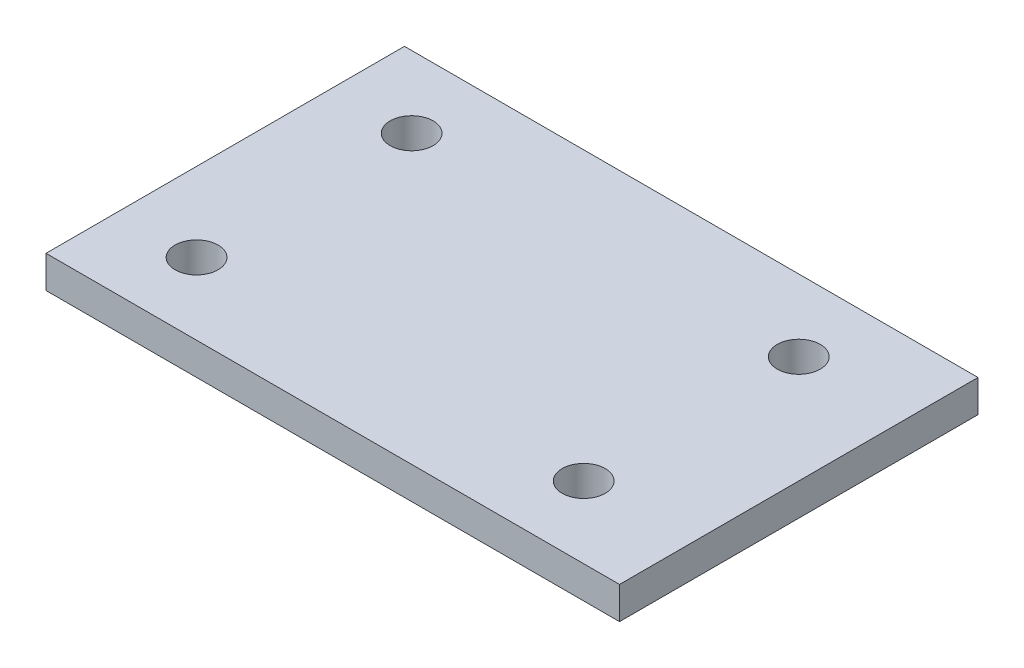
ISO-10303-21;
HEADER;
FILE_DESCRIPTION(('STEP AP214'),'2;1');
FILE_NAME('part.step','',(''),(''),'','','');
FILE_SCHEMA(('AUTOMOTIVE_DESIGN { 1 0 10303 214 1 1 1 1 }'));
ENDSEC;
DATA;
#1=APPLICATION_CONTEXT('core data for automotive mechanical design processes');
#2=APPLICATION_PROTOCOL_DEFINITION('international standard','automotive_design',2000,#1);
#3=PRODUCT_CONTEXT('',#1,'mechanical');
#4=PRODUCT('Part','Part','',(#3));
#5=PRODUCT_RELATED_PRODUCT_CATEGORY('part','',(#4));
#6=PRODUCT_DEFINITION_FORMATION('','',#4);
#7=PRODUCT_DEFINITION_CONTEXT('part definition',#1,'design');
#8=PRODUCT_DEFINITION('design','',#6,#7);
#9=PRODUCT_DEFINITION_SHAPE('','',#8);
#10=(LENGTH_UNIT() NAMED_UNIT(*) SI_UNIT(.MILLI.,.METRE.));
#11=(NAMED_UNIT(*) PLANE_ANGLE_UNIT() SI_UNIT($,.RADIAN.));
#12=(NAMED_UNIT(*) SI_UNIT($,.STERADIAN.) SOLID_ANGLE_UNIT());
#13=UNCERTAINTY_MEASURE_WITH_UNIT(LENGTH_MEASURE(1.E-05),#10,'distance_accuracy_value','');
#14=(GEOMETRIC_REPRESENTATION_CONTEXT(3) GLOBAL_UNCERTAINTY_ASSIGNED_CONTEXT((#13)) GLOBAL_UNIT_ASSIGNED_CONTEXT((#10,
#11,#12)) REPRESENTATION_CONTEXT('',''));
#15=CARTESIAN_POINT('',(0.,0.,0.));
#16=DIRECTION('',(0.,0.,1.));
#17=DIRECTION('',(1.,0.,0.));
#18=AXIS2_PLACEMENT_3D('',#15,#16,#17);
#19=CARTESIAN_POINT('',(0.,4.5,0.));
#20=DIRECTION('',(1.,0.,0.));
#21=DIRECTION('',(0.,0.,-1.));
#22=AXIS2_PLACEMENT_3D('',#19,#20,#21);
#23=PLANE('',#22);
#24=DIRECTION('',(0.,0.,1.));
#25=VECTOR('',#24,1.);
#26=CARTESIAN_POINT('',(0.,0.,0.));
#27=LINE('',#26,#25);
#28=CARTESIAN_POINT('',(0.,0.,-50.));
#29=VERTEX_POINT('',#28);
#30=CARTESIAN_POINT('',(0.,0.,0.));
#31=VERTEX_POINT('',#30);
#32=EDGE_CURVE('E99',#29,#31,#27,.T.);
#33=ORIENTED_EDGE('',*,*,#32,.T.);
#34=DIRECTION('',(0.,-1.,0.));
#35=VECTOR('',#34,1.);
#36=CARTESIAN_POINT('',(0.,4.5,0.));
#37=LINE('',#36,#35);
#38=CARTESIAN_POINT('',(0.,4.5,0.));
#39=VERTEX_POINT('',#38);
#40=EDGE_CURVE('E11',#39,#31,#37,.T.);
#41=ORIENTED_EDGE('',*,*,#40,.F.);
#42=DIRECTION('',(0.,0.,1.));
#43=VECTOR('',#42,1.);
#44=CARTESIAN_POINT('',(0.,4.5,0.));
#45=LINE('',#44,#43);
#46=CARTESIAN_POINT('',(0.,4.5,-50.));
#47=VERTEX_POINT('',#46);
#48=EDGE_CURVE('E86',#47,#39,#45,.T.);
#49=ORIENTED_EDGE('',*,*,#48,.F.);
#50=DIRECTION('',(0.,-1.,0.));
#51=VECTOR('',#50,1.);
#52=CARTESIAN_POINT('',(0.,4.5,-50.));
#53=LINE('',#52,#51);
#54=EDGE_CURVE('E95',#47,#29,#53,.T.);
#55=ORIENTED_EDGE('',*,*,#54,.T.);
#56=EDGE_LOOP('',(#33,#41,#49,#55));
#57=FACE_BOUND('',#56,.T.);
#58=ADVANCED_FACE('F33',(#57),#23,.F.);
#59=CARTESIAN_POINT('',(0.,4.5,0.));
#60=DIRECTION('',(0.,0.,-1.));
#61=DIRECTION('',(-1.,0.,0.));
#62=AXIS2_PLACEMENT_3D('',#59,#60,#61);
#63=PLANE('',#62);
#64=DIRECTION('',(1.,0.,0.));
#65=VECTOR('',#64,1.);
#66=CARTESIAN_POINT('',(0.,0.,0.));
#67=LINE('',#66,#65);
#68=CARTESIAN_POINT('',(80.,0.,0.));
#69=VERTEX_POINT('',#68);
#70=EDGE_CURVE('E90',#31,#69,#67,.T.);
#71=ORIENTED_EDGE('',*,*,#70,.T.);
#72=DIRECTION('',(0.,-1.,0.));
#73=VECTOR('',#72,1.);
#74=CARTESIAN_POINT('',(80.,4.5,0.));
#75=LINE('',#74,#73);
#76=CARTESIAN_POINT('',(80.,4.5,0.));
#77=VERTEX_POINT('',#76);
#78=EDGE_CURVE('E42',#77,#69,#75,.T.);
#79=ORIENTED_EDGE('',*,*,#78,.F.);
#80=DIRECTION('',(1.,0.,0.));
#81=VECTOR('',#80,1.);
#82=CARTESIAN_POINT('',(0.,4.5,0.));
#83=LINE('',#82,#81);
#84=EDGE_CURVE('E81',#39,#77,#83,.T.);
#85=ORIENTED_EDGE('',*,*,#84,.F.);
#86=ORIENTED_EDGE('',*,*,#40,.T.);
#87=EDGE_LOOP('',(#71,#79,#85,#86));
#88=FACE_BOUND('',#87,.T.);
#89=ADVANCED_FACE('F89',(#88),#63,.F.);
#90=CARTESIAN_POINT('',(80.,4.5,0.));
#91=DIRECTION('',(-1.,0.,0.));
#92=DIRECTION('',(0.,0.,1.));
#93=AXIS2_PLACEMENT_3D('',#90,#91,#92);
#94=PLANE('',#93);
#95=DIRECTION('',(0.,0.,-1.));
#96=VECTOR('',#95,1.);
#97=CARTESIAN_POINT('',(80.,0.,0.));
#98=LINE('',#97,#96);
#99=CARTESIAN_POINT('',(80.,0.,-50.));
#100=VERTEX_POINT('',#99);
#101=EDGE_CURVE('E68',#69,#100,#98,.T.);
#102=ORIENTED_EDGE('',*,*,#101,.T.);
#103=DIRECTION('',(0.,-1.,0.));
#104=VECTOR('',#103,1.);
#105=CARTESIAN_POINT('',(80.,4.5,-50.));
#106=LINE('',#105,#104);
#107=CARTESIAN_POINT('',(80.,4.5,-50.));
#108=VERTEX_POINT('',#107);
#109=EDGE_CURVE('E91',#108,#100,#106,.T.);
#110=ORIENTED_EDGE('',*,*,#109,.F.);
#111=DIRECTION('',(0.,0.,-1.));
#112=VECTOR('',#111,1.);
#113=CARTESIAN_POINT('',(80.,4.5,0.));
#114=LINE('',#113,#112);
#115=EDGE_CURVE('E84',#77,#108,#114,.T.);
#116=ORIENTED_EDGE('',*,*,#115,.F.);
#117=ORIENTED_EDGE('',*,*,#78,.T.);
#118=EDGE_LOOP('',(#102,#110,#116,#117));
#119=FACE_BOUND('',#118,.T.);
#120=ADVANCED_FACE('F93',(#119),#94,.F.);
#121=CARTESIAN_POINT('',(0.,4.5,-50.));
#122=DIRECTION('',(0.,0.,1.));
#123=DIRECTION('',(1.,0.,0.));
#124=AXIS2_PLACEMENT_3D('',#121,#122,#123);
#125=PLANE('',#124);
#126=DIRECTION('',(-1.,0.,0.));
#127=VECTOR('',#126,1.);
#128=CARTESIAN_POINT('',(0.,0.,-50.));
#129=LINE('',#128,#127);
#130=EDGE_CURVE('E74',#100,#29,#129,.T.);
#131=ORIENTED_EDGE('',*,*,#130,.T.);
#132=ORIENTED_EDGE('',*,*,#54,.F.);
#133=DIRECTION('',(-1.,0.,0.));
#134=VECTOR('',#133,1.);
#135=CARTESIAN_POINT('',(0.,4.5,-50.));
#136=LINE('',#135,#134);
#137=EDGE_CURVE('E51',#108,#47,#136,.T.);
#138=ORIENTED_EDGE('',*,*,#137,.F.);
#139=ORIENTED_EDGE('',*,*,#109,.T.);
#140=EDGE_LOOP('',(#131,#132,#138,#139));
#141=FACE_BOUND('',#140,.T.);
#142=ADVANCED_FACE('F136',(#141),#125,.F.);
#143=CARTESIAN_POINT('',(0.,4.5,0.));
#144=DIRECTION('',(0.,-1.,0.));
#145=DIRECTION('',(0.,0.,-1.));
#146=AXIS2_PLACEMENT_3D('',#143,#144,#145);
#147=PLANE('',#146);
#148=CARTESIAN_POINT('',(10.9999999999931,4.5,-9.99999999999987));
#149=DIRECTION('',(0.,1.,0.));
#150=DIRECTION('',(0.,0.,1.));
#151=AXIS2_PLACEMENT_3D('',#148,#149,#150);
#152=CIRCLE('',#151,3.);
#153=CARTESIAN_POINT('',(10.9999999999931,4.5,-6.99999999999987));
#154=VERTEX_POINT('',#153);
#155=EDGE_CURVE('E121',#154,#154,#152,.T.);
#156=ORIENTED_EDGE('',*,*,#155,.F.);
#157=EDGE_LOOP('',(#156));
#158=FACE_BOUND('',#157,.T.);
#159=CARTESIAN_POINT('',(10.9999999999931,4.5,-39.9999999999999));
#160=DIRECTION('',(0.,1.,0.));
#161=DIRECTION('',(0.,0.,1.));
#162=AXIS2_PLACEMENT_3D('',#159,#160,#161);
#163=CIRCLE('',#162,3.);
#164=CARTESIAN_POINT('',(10.9999999999931,4.5,-36.9999999999999));
#165=VERTEX_POINT('',#164);
#166=EDGE_CURVE('E110',#165,#165,#163,.T.);
#167=ORIENTED_EDGE('',*,*,#166,.F.);
#168=EDGE_LOOP('',(#167));
#169=FACE_BOUND('',#168,.T.);
#170=CARTESIAN_POINT('',(65.,4.5,-10.));
#171=DIRECTION('',(0.,1.,0.));
#172=DIRECTION('',(0.,0.,1.));
#173=AXIS2_PLACEMENT_3D('',#170,#171,#172);
#174=CIRCLE('',#173,3.00000000000001);
#175=CARTESIAN_POINT('',(65.,4.5,-6.99999999999999));
#176=VERTEX_POINT('',#175);
#177=EDGE_CURVE('E109',#176,#176,#174,.T.);
#178=ORIENTED_EDGE('',*,*,#177,.F.);
#179=EDGE_LOOP('',(#178));
#180=FACE_BOUND('',#179,.T.);
#181=CARTESIAN_POINT('',(65.,4.5,-40.));
#182=DIRECTION('',(0.,1.,0.));
#183=DIRECTION('',(0.,0.,1.));
#184=AXIS2_PLACEMENT_3D('',#181,#182,#183);
#185=CIRCLE('',#184,3.00000000000001);
#186=CARTESIAN_POINT('',(65.,4.5,-37.));
#187=VERTEX_POINT('',#186);
#188=EDGE_CURVE('E125',#187,#187,#185,.T.);
#189=ORIENTED_EDGE('',*,*,#188,.F.);
#190=EDGE_LOOP('',(#189));
#191=FACE_BOUND('',#190,.T.);
#192=ORIENTED_EDGE('',*,*,#48,.T.);
#193=ORIENTED_EDGE('',*,*,#84,.T.);
#194=ORIENTED_EDGE('',*,*,#115,.T.);
#195=ORIENTED_EDGE('',*,*,#137,.T.);
#196=EDGE_LOOP('',(#192,#193,#194,#195));
#197=FACE_BOUND('',#196,.T.);
#198=ADVANCED_FACE('F82',(#158,#169,#180,#191,#197),#147,.F.);
#199=CARTESIAN_POINT('',(0.,0.,0.));
#200=DIRECTION('',(0.,-1.,0.));
#201=DIRECTION('',(0.,0.,-1.));
#202=AXIS2_PLACEMENT_3D('',#199,#200,#201);
#203=PLANE('',#202);
#204=CARTESIAN_POINT('',(10.9999999999931,0.,-9.99999999999987));
#205=DIRECTION('',(0.,-1.,0.));
#206=DIRECTION('',(0.,0.,-1.));
#207=AXIS2_PLACEMENT_3D('',#204,#205,#206);
#208=CIRCLE('',#207,3.);
#209=CARTESIAN_POINT('',(10.9999999999931,0.,-12.9999999999999));
#210=VERTEX_POINT('',#209);
#211=EDGE_CURVE('E36',#210,#210,#208,.T.);
#212=ORIENTED_EDGE('',*,*,#211,.F.);
#213=EDGE_LOOP('',(#212));
#214=FACE_BOUND('',#213,.T.);
#215=CARTESIAN_POINT('',(10.9999999999931,0.,-39.9999999999999));
#216=DIRECTION('',(0.,-1.,0.));
#217=DIRECTION('',(0.,0.,-1.));
#218=AXIS2_PLACEMENT_3D('',#215,#216,#217);
#219=CIRCLE('',#218,3.);
#220=CARTESIAN_POINT('',(10.9999999999931,0.,-42.9999999999999));
#221=VERTEX_POINT('',#220);
#222=EDGE_CURVE('E107',#221,#221,#219,.T.);
#223=ORIENTED_EDGE('',*,*,#222,.F.);
#224=EDGE_LOOP('',(#223));
#225=FACE_BOUND('',#224,.T.);
#226=CARTESIAN_POINT('',(65.,0.,-10.));
#227=DIRECTION('',(0.,1.,0.));
#228=DIRECTION('',(0.,0.,1.));
#229=AXIS2_PLACEMENT_3D('',#226,#227,#228);
#230=CIRCLE('',#229,3.00000000000001);
#231=CARTESIAN_POINT('',(65.,0.,-6.99999999999999));
#232=VERTEX_POINT('',#231);
#233=EDGE_CURVE('E114',#232,#232,#230,.T.);
#234=ORIENTED_EDGE('',*,*,#233,.T.);
#235=EDGE_LOOP('',(#234));
#236=FACE_BOUND('',#235,.T.);
#237=CARTESIAN_POINT('',(65.,0.,-40.));
#238=DIRECTION('',(0.,1.,0.));
#239=DIRECTION('',(0.,0.,1.));
#240=AXIS2_PLACEMENT_3D('',#237,#238,#239);
#241=CIRCLE('',#240,3.00000000000001);
#242=CARTESIAN_POINT('',(65.,0.,-37.));
#243=VERTEX_POINT('',#242);
#244=EDGE_CURVE('E102',#243,#243,#241,.T.);
#245=ORIENTED_EDGE('',*,*,#244,.T.);
#246=EDGE_LOOP('',(#245));
#247=FACE_BOUND('',#246,.T.);
#248=ORIENTED_EDGE('',*,*,#32,.F.);
#249=ORIENTED_EDGE('',*,*,#130,.F.);
#250=ORIENTED_EDGE('',*,*,#101,.F.);
#251=ORIENTED_EDGE('',*,*,#70,.F.);
#252=EDGE_LOOP('',(#248,#249,#250,#251));
#253=FACE_BOUND('',#252,.T.);
#254=ADVANCED_FACE('F135',(#214,#225,#236,#247,#253),#203,.T.);
#255=CARTESIAN_POINT('',(65.,0.,-40.));
#256=DIRECTION('',(0.,1.,0.));
#257=DIRECTION('',(0.,0.,1.));
#258=AXIS2_PLACEMENT_3D('',#255,#256,#257);
#259=CYLINDRICAL_SURFACE('',#258,3.00000000000001);
#260=ORIENTED_EDGE('',*,*,#244,.F.);
#261=EDGE_LOOP('',(#260));
#262=FACE_BOUND('',#261,.T.);
#263=ORIENTED_EDGE('',*,*,#188,.T.);
#264=EDGE_LOOP('',(#263));
#265=FACE_BOUND('',#264,.T.);
#266=ADVANCED_FACE('F132',(#262,#265),#259,.F.);
#267=CARTESIAN_POINT('',(65.,0.,-10.));
#268=DIRECTION('',(0.,1.,0.));
#269=DIRECTION('',(0.,0.,1.));
#270=AXIS2_PLACEMENT_3D('',#267,#268,#269);
#271=CYLINDRICAL_SURFACE('',#270,3.00000000000001);
#272=ORIENTED_EDGE('',*,*,#233,.F.);
#273=EDGE_LOOP('',(#272));
#274=FACE_BOUND('',#273,.T.);
#275=ORIENTED_EDGE('',*,*,#177,.T.);
#276=EDGE_LOOP('',(#275));
#277=FACE_BOUND('',#276,.T.);
#278=ADVANCED_FACE('F185',(#274,#277),#271,.F.);
#279=CARTESIAN_POINT('',(10.9999999999931,-5.5,-39.9999999999999));
#280=DIRECTION('',(0.,1.,0.));
#281=DIRECTION('',(0.,0.,1.));
#282=AXIS2_PLACEMENT_3D('',#279,#280,#281);
#283=CYLINDRICAL_SURFACE('',#282,3.);
#284=ORIENTED_EDGE('',*,*,#222,.T.);
#285=EDGE_LOOP('',(#284));
#286=FACE_BOUND('',#285,.T.);
#287=ORIENTED_EDGE('',*,*,#166,.T.);
#288=EDGE_LOOP('',(#287));
#289=FACE_BOUND('',#288,.T.);
#290=ADVANCED_FACE('F190',(#286,#289),#283,.F.);
#291=CARTESIAN_POINT('',(10.9999999999931,-5.5,-9.99999999999987));
#292=DIRECTION('',(0.,1.,0.));
#293=DIRECTION('',(0.,0.,1.));
#294=AXIS2_PLACEMENT_3D('',#291,#292,#293);
#295=CYLINDRICAL_SURFACE('',#294,3.);
#296=ORIENTED_EDGE('',*,*,#211,.T.);
#297=EDGE_LOOP('',(#296));
#298=FACE_BOUND('',#297,.T.);
#299=ORIENTED_EDGE('',*,*,#155,.T.);
#300=EDGE_LOOP('',(#299));
#301=FACE_BOUND('',#300,.T.);
#302=ADVANCED_FACE('F197',(#298,#301),#295,.F.);
#303=CLOSED_SHELL('',(#58,#89,#120,#142,#198,#254,#266,#278,#290,#302));
#304=MANIFOLD_SOLID_BREP('B2',#303);
#305=ADVANCED_BREP_SHAPE_REPRESENTATION('',(#18,#304),#14);
#306=SHAPE_DEFINITION_REPRESENTATION(#9,#305);
ENDSEC;
END-ISO-10303-21;
